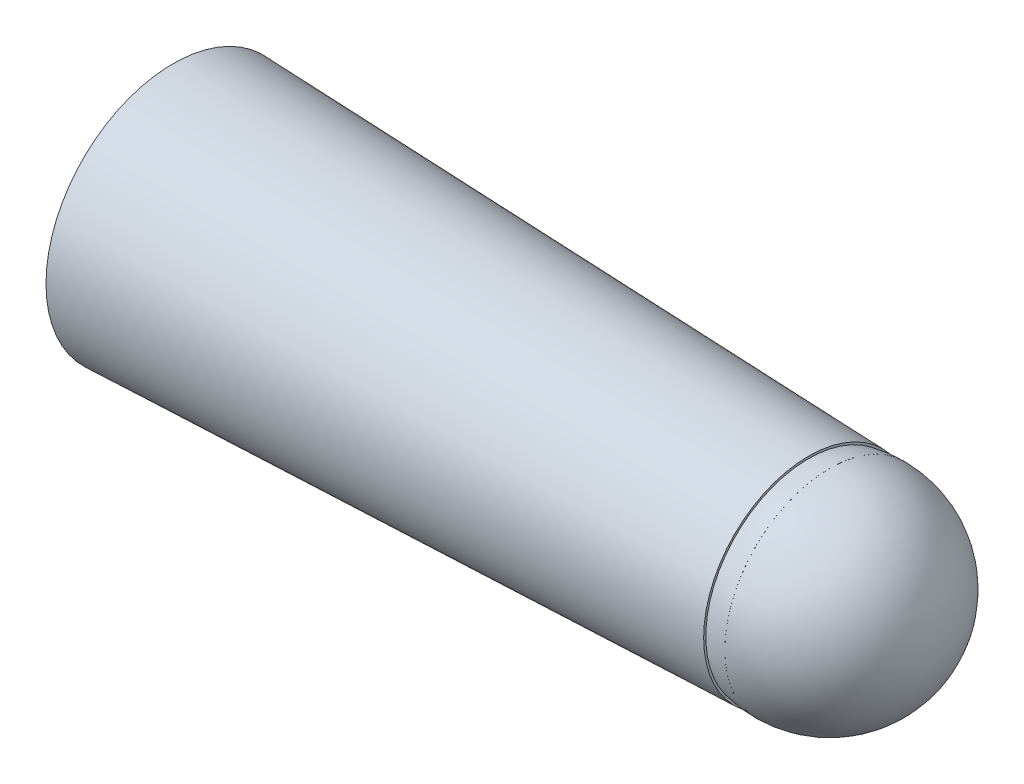
ISO-10303-21;
HEADER;
FILE_DESCRIPTION(('STEP AP214'),'2;1');
FILE_NAME('part.step','',(''),(''),'','','');
FILE_SCHEMA(('AUTOMOTIVE_DESIGN { 1 0 10303 214 1 1 1 1 }'));
ENDSEC;
DATA;
#1=APPLICATION_CONTEXT('core data for automotive mechanical design processes');
#2=APPLICATION_PROTOCOL_DEFINITION('international standard','automotive_design',2000,#1);
#3=PRODUCT_CONTEXT('',#1,'mechanical');
#4=PRODUCT('Part','Part','',(#3));
#5=PRODUCT_RELATED_PRODUCT_CATEGORY('part','',(#4));
#6=PRODUCT_DEFINITION_FORMATION('','',#4);
#7=PRODUCT_DEFINITION_CONTEXT('part definition',#1,'design');
#8=PRODUCT_DEFINITION('design','',#6,#7);
#9=PRODUCT_DEFINITION_SHAPE('','',#8);
#10=(LENGTH_UNIT() NAMED_UNIT(*) SI_UNIT(.MILLI.,.METRE.));
#11=(NAMED_UNIT(*) PLANE_ANGLE_UNIT() SI_UNIT($,.RADIAN.));
#12=(NAMED_UNIT(*) SI_UNIT($,.STERADIAN.) SOLID_ANGLE_UNIT());
#13=UNCERTAINTY_MEASURE_WITH_UNIT(LENGTH_MEASURE(1.E-05),#10,'distance_accuracy_value','');
#14=(GEOMETRIC_REPRESENTATION_CONTEXT(3) GLOBAL_UNCERTAINTY_ASSIGNED_CONTEXT((#13)) GLOBAL_UNIT_ASSIGNED_CONTEXT((#10,
#11,#12)) REPRESENTATION_CONTEXT('',''));
#15=CARTESIAN_POINT('',(0.,0.,0.));
#16=DIRECTION('',(0.,0.,1.));
#17=DIRECTION('',(1.,0.,0.));
#18=AXIS2_PLACEMENT_3D('',#15,#16,#17);
#19=CARTESIAN_POINT('',(15.5,0.,0.));
#20=DIRECTION('',(1.,0.,0.));
#21=DIRECTION('',(0.,0.,-1.));
#22=AXIS2_PLACEMENT_3D('',#19,#20,#21);
#23=PLANE('',#22);
#24=CARTESIAN_POINT('',(15.5,0.,0.));
#25=DIRECTION('',(1.,0.,0.));
#26=DIRECTION('',(0.,0.,-1.));
#27=AXIS2_PLACEMENT_3D('',#24,#25,#26);
#28=CIRCLE('',#27,2.47618845762378);
#29=CARTESIAN_POINT('',(15.5,0.,-2.47618845762378));
#30=VERTEX_POINT('',#29);
#31=EDGE_CURVE('E11',#30,#30,#28,.T.);
#32=ORIENTED_EDGE('',*,*,#31,.T.);
#33=EDGE_LOOP('',(#32));
#34=FACE_BOUND('',#33,.T.);
#35=ADVANCED_FACE('F42',(#34),#23,.T.);
#36=OPEN_SHELL('',(#35));
#37=SHELL_BASED_SURFACE_MODEL('B2',(#36));
#38=CARTESIAN_POINT('',(15.,0.,0.));
#39=DIRECTION('',(1.,0.,0.));
#40=DIRECTION('',(0.,0.,-1.));
#41=AXIS2_PLACEMENT_3D('',#38,#39,#40);
#42=PLANE('',#41);
#43=CARTESIAN_POINT('',(15.,0.,0.));
#44=DIRECTION('',(1.,0.,0.));
#45=DIRECTION('',(0.,0.,-1.));
#46=AXIS2_PLACEMENT_3D('',#43,#44,#45);
#47=CIRCLE('',#46,2.47618845762378);
#48=CARTESIAN_POINT('',(15.,0.,-2.47618845762378));
#49=VERTEX_POINT('',#48);
#50=EDGE_CURVE('E41',#49,#49,#47,.T.);
#51=ORIENTED_EDGE('',*,*,#50,.T.);
#52=EDGE_LOOP('',(#51));
#53=FACE_BOUND('',#52,.T.);
#54=CARTESIAN_POINT('',(15.,0.,0.));
#55=DIRECTION('',(1.,0.,0.));
#56=DIRECTION('',(0.,0.,-1.));
#57=AXIS2_PLACEMENT_3D('',#54,#55,#56);
#58=CIRCLE('',#57,2.42518231843902);
#59=CARTESIAN_POINT('',(15.,0.,-2.42518231843902));
#60=VERTEX_POINT('',#59);
#61=EDGE_CURVE('E62',#60,#60,#58,.F.);
#62=ORIENTED_EDGE('',*,*,#61,.T.);
#63=EDGE_LOOP('',(#62));
#64=FACE_BOUND('',#63,.T.);
#65=ADVANCED_FACE('F58',(#53,#64),#42,.T.);
#66=CARTESIAN_POINT('',(0.,0.,0.));
#67=DIRECTION('',(-1.,0.,0.));
#68=DIRECTION('',(0.,0.,-1.));
#69=AXIS2_PLACEMENT_3D('',#66,#67,#68);
#70=CONICAL_SURFACE('',#69,3.,0.0349065850398866);
#71=ORIENTED_EDGE('',*,*,#50,.F.);
#72=EDGE_LOOP('',(#71));
#73=FACE_BOUND('',#72,.T.);
#74=CARTESIAN_POINT('',(0.,0.,0.));
#75=DIRECTION('',(1.,0.,0.));
#76=DIRECTION('',(0.,0.,-1.));
#77=AXIS2_PLACEMENT_3D('',#74,#75,#76);
#78=CIRCLE('',#77,3.);
#79=CARTESIAN_POINT('',(0.,0.,-3.));
#80=VERTEX_POINT('',#79);
#81=EDGE_CURVE('E66',#80,#80,#78,.T.);
#82=ORIENTED_EDGE('',*,*,#81,.T.);
#83=EDGE_LOOP('',(#82));
#84=FACE_BOUND('',#83,.T.);
#85=ADVANCED_FACE('F60',(#73,#84),#70,.T.);
#86=CARTESIAN_POINT('',(0.,0.,0.));
#87=DIRECTION('',(1.,0.,0.));
#88=DIRECTION('',(0.,0.,-1.));
#89=AXIS2_PLACEMENT_3D('',#86,#87,#88);
#90=PLANE('',#89);
#91=ORIENTED_EDGE('',*,*,#81,.F.);
#92=EDGE_LOOP('',(#91));
#93=FACE_BOUND('',#92,.T.);
#94=ADVANCED_FACE('F79',(#93),#90,.F.);
#95=CARTESIAN_POINT('',(15.5,0.,0.));
#96=DIRECTION('',(0.,1.,0.));
#97=DIRECTION('',(0.,0.,-1.));
#98=AXIS2_PLACEMENT_3D('',#95,#96,#97);
#99=SPHERICAL_SURFACE('',#98,2.47618845762378);
#100=CARTESIAN_POINT('',(15.5,0.,0.));
#101=DIRECTION('',(1.,0.,0.));
#102=DIRECTION('',(0.,0.,-1.));
#103=AXIS2_PLACEMENT_3D('',#100,#101,#102);
#104=SPHERICAL_SURFACE('',#103,2.47618845762378);
#105=ORIENTED_EDGE('',*,*,#61,.F.);
#106=EDGE_LOOP('',(#105));
#107=FACE_BOUND('',#106,.T.);
#108=ADVANCED_FACE('F77',(#107),#104,.T.);
#109=CLOSED_SHELL('',(#65,#85,#94,#108));
#110=MANIFOLD_SOLID_BREP('B6',#109);
#111=ADVANCED_BREP_SHAPE_REPRESENTATION('',(#18,#110),#14);
#112=MANIFOLD_SURFACE_SHAPE_REPRESENTATION('',(#18,#37),#14);
#113=SHAPE_REPRESENTATION('',(#18),#14);
#114=SHAPE_DEFINITION_REPRESENTATION(#9,#113);
#115=SHAPE_REPRESENTATION_RELATIONSHIP('','',#113,#111);
#116=SHAPE_REPRESENTATION_RELATIONSHIP('','',#113,#112);
ENDSEC;
END-ISO-10303-21;
